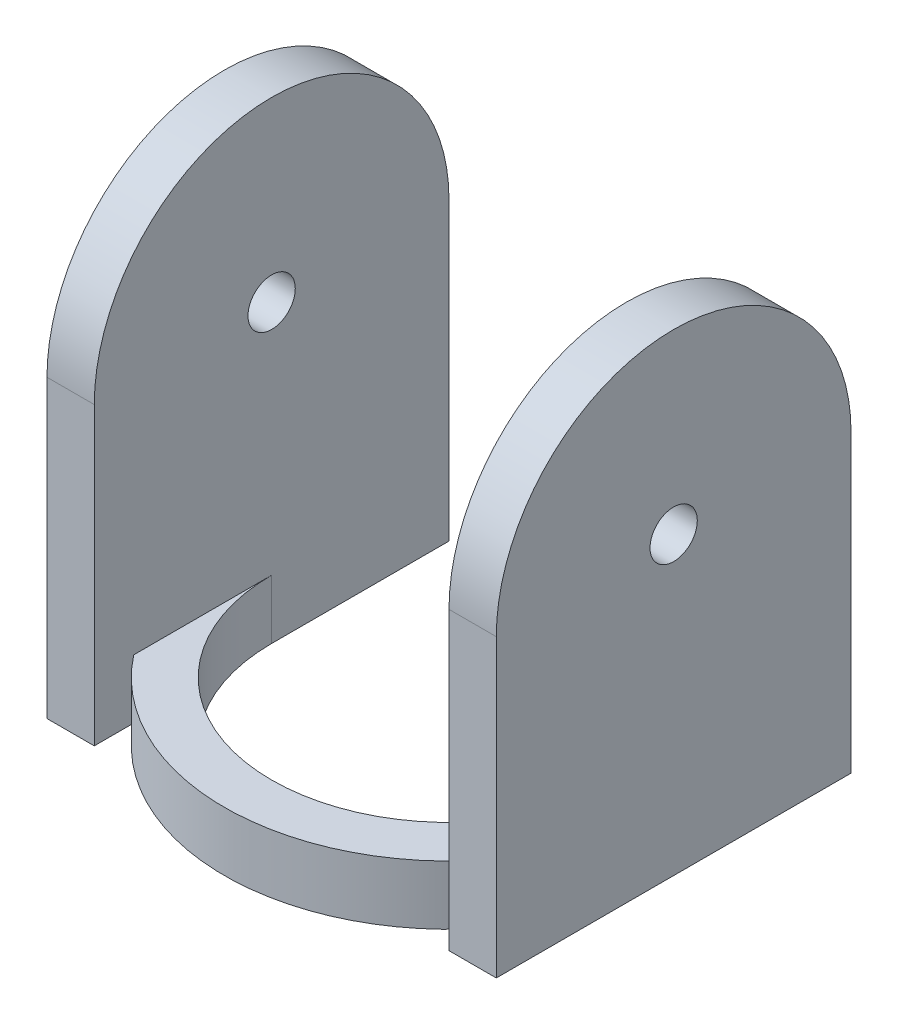
ISO-10303-21;
HEADER;
FILE_DESCRIPTION(('STEP AP214'),'2;1');
FILE_NAME('part.step','',(''),(''),'','','');
FILE_SCHEMA(('AUTOMOTIVE_DESIGN { 1 0 10303 214 1 1 1 1 }'));
ENDSEC;
DATA;
#1=APPLICATION_CONTEXT('core data for automotive mechanical design processes');
#2=APPLICATION_PROTOCOL_DEFINITION('international standard','automotive_design',2000,#1);
#3=PRODUCT_CONTEXT('',#1,'mechanical');
#4=PRODUCT('Part','Part','',(#3));
#5=PRODUCT_RELATED_PRODUCT_CATEGORY('part','',(#4));
#6=PRODUCT_DEFINITION_FORMATION('','',#4);
#7=PRODUCT_DEFINITION_CONTEXT('part definition',#1,'design');
#8=PRODUCT_DEFINITION('design','',#6,#7);
#9=PRODUCT_DEFINITION_SHAPE('','',#8);
#10=(LENGTH_UNIT() NAMED_UNIT(*) SI_UNIT(.MILLI.,.METRE.));
#11=(NAMED_UNIT(*) PLANE_ANGLE_UNIT() SI_UNIT($,.RADIAN.));
#12=(NAMED_UNIT(*) SI_UNIT($,.STERADIAN.) SOLID_ANGLE_UNIT());
#13=UNCERTAINTY_MEASURE_WITH_UNIT(LENGTH_MEASURE(1.E-05),#10,'distance_accuracy_value','');
#14=(GEOMETRIC_REPRESENTATION_CONTEXT(3) GLOBAL_UNCERTAINTY_ASSIGNED_CONTEXT((#13)) GLOBAL_UNIT_ASSIGNED_CONTEXT((#10,
#11,#12)) REPRESENTATION_CONTEXT('',''));
#15=CARTESIAN_POINT('',(0.,0.,0.));
#16=DIRECTION('',(0.,0.,1.));
#17=DIRECTION('',(1.,0.,0.));
#18=AXIS2_PLACEMENT_3D('',#15,#16,#17);
#19=CARTESIAN_POINT('',(-38.,80.,30.));
#20=DIRECTION('',(0.,0.,1.));
#21=DIRECTION('',(1.,0.,0.));
#22=AXIS2_PLACEMENT_3D('',#19,#20,#21);
#23=PLANE('',#22);
#24=DIRECTION('',(0.,-1.,0.));
#25=VECTOR('',#24,1.);
#26=CARTESIAN_POINT('',(-30.,80.,30.));
#27=LINE('',#26,#25);
#28=CARTESIAN_POINT('',(-30.,50.,30.));
#29=VERTEX_POINT('',#28);
#30=CARTESIAN_POINT('',(-30.,0.,30.));
#31=VERTEX_POINT('',#30);
#32=EDGE_CURVE('E174',#29,#31,#27,.T.);
#33=ORIENTED_EDGE('',*,*,#32,.F.);
#34=DIRECTION('',(1.,0.,0.));
#35=VECTOR('',#34,1.);
#36=CARTESIAN_POINT('',(-42.,50.,30.));
#37=LINE('',#36,#35);
#38=CARTESIAN_POINT('',(-38.,50.,30.));
#39=VERTEX_POINT('',#38);
#40=EDGE_CURVE('E246',#39,#29,#37,.T.);
#41=ORIENTED_EDGE('',*,*,#40,.F.);
#42=DIRECTION('',(0.,-1.,0.));
#43=VECTOR('',#42,1.);
#44=CARTESIAN_POINT('',(-38.,80.,30.));
#45=LINE('',#44,#43);
#46=CARTESIAN_POINT('',(-38.,0.,30.));
#47=VERTEX_POINT('',#46);
#48=EDGE_CURVE('E166',#39,#47,#45,.T.);
#49=ORIENTED_EDGE('',*,*,#48,.T.);
#50=DIRECTION('',(-1.,0.,0.));
#51=VECTOR('',#50,1.);
#52=CARTESIAN_POINT('',(-38.,0.,30.));
#53=LINE('',#52,#51);
#54=EDGE_CURVE('E140',#31,#47,#53,.T.);
#55=ORIENTED_EDGE('',*,*,#54,.F.);
#56=EDGE_LOOP('',(#33,#41,#49,#55));
#57=FACE_BOUND('',#56,.T.);
#58=ADVANCED_FACE('F38',(#57),#23,.T.);
#59=CARTESIAN_POINT('',(38.,80.,30.));
#60=DIRECTION('',(0.,0.,1.));
#61=DIRECTION('',(1.,0.,0.));
#62=AXIS2_PLACEMENT_3D('',#59,#60,#61);
#63=PLANE('',#62);
#64=DIRECTION('',(0.,-1.,0.));
#65=VECTOR('',#64,1.);
#66=CARTESIAN_POINT('',(38.,80.,30.));
#67=LINE('',#66,#65);
#68=CARTESIAN_POINT('',(38.,50.,30.));
#69=VERTEX_POINT('',#68);
#70=CARTESIAN_POINT('',(38.,0.,30.));
#71=VERTEX_POINT('',#70);
#72=EDGE_CURVE('E195',#69,#71,#67,.T.);
#73=ORIENTED_EDGE('',*,*,#72,.F.);
#74=CARTESIAN_POINT('',(30.,50.,30.));
#75=VERTEX_POINT('',#74);
#76=EDGE_CURVE('E252',#75,#69,#37,.T.);
#77=ORIENTED_EDGE('',*,*,#76,.F.);
#78=DIRECTION('',(0.,-1.,0.));
#79=VECTOR('',#78,1.);
#80=CARTESIAN_POINT('',(30.,80.,30.));
#81=LINE('',#80,#79);
#82=CARTESIAN_POINT('',(30.,0.,30.));
#83=VERTEX_POINT('',#82);
#84=EDGE_CURVE('E198',#75,#83,#81,.T.);
#85=ORIENTED_EDGE('',*,*,#84,.T.);
#86=DIRECTION('',(-1.,0.,0.));
#87=VECTOR('',#86,1.);
#88=CARTESIAN_POINT('',(38.,0.,30.));
#89=LINE('',#88,#87);
#90=EDGE_CURVE('E214',#71,#83,#89,.T.);
#91=ORIENTED_EDGE('',*,*,#90,.F.);
#92=EDGE_LOOP('',(#73,#77,#85,#91));
#93=FACE_BOUND('',#92,.T.);
#94=ADVANCED_FACE('F295',(#93),#63,.T.);
#95=CARTESIAN_POINT('',(0.,10.,0.));
#96=DIRECTION('',(0.,1.,0.));
#97=DIRECTION('',(0.,0.,1.));
#98=AXIS2_PLACEMENT_3D('',#95,#96,#97);
#99=PLANE('',#98);
#100=DIRECTION('',(0.,0.,1.));
#101=VECTOR('',#100,1.);
#102=CARTESIAN_POINT('',(30.,10.,0.));
#103=LINE('',#102,#101);
#104=CARTESIAN_POINT('',(30.,9.99999999999999,0.));
#105=VERTEX_POINT('',#104);
#106=CARTESIAN_POINT('',(30.,10.,23.3238075793812));
#107=VERTEX_POINT('',#106);
#108=EDGE_CURVE('E190',#105,#107,#103,.T.);
#109=ORIENTED_EDGE('',*,*,#108,.F.);
#110=CARTESIAN_POINT('',(0.,10.,0.));
#111=DIRECTION('',(0.,1.,0.));
#112=DIRECTION('',(0.,0.,1.));
#113=AXIS2_PLACEMENT_3D('',#110,#111,#112);
#114=CIRCLE('',#113,30.);
#115=CARTESIAN_POINT('',(-30.,10.,0.));
#116=VERTEX_POINT('',#115);
#117=EDGE_CURVE('E157',#116,#105,#114,.T.);
#118=ORIENTED_EDGE('',*,*,#117,.F.);
#119=DIRECTION('',(0.,0.,-1.));
#120=VECTOR('',#119,1.);
#121=CARTESIAN_POINT('',(-30.,10.,0.));
#122=LINE('',#121,#120);
#123=CARTESIAN_POINT('',(-30.,10.,23.3238075793812));
#124=VERTEX_POINT('',#123);
#125=EDGE_CURVE('E147',#124,#116,#122,.T.);
#126=ORIENTED_EDGE('',*,*,#125,.F.);
#127=CARTESIAN_POINT('',(0.,10.,0.));
#128=DIRECTION('',(0.,1.,0.));
#129=DIRECTION('',(0.,0.,1.));
#130=AXIS2_PLACEMENT_3D('',#127,#128,#129);
#131=CIRCLE('',#130,38.);
#132=EDGE_CURVE('E11',#124,#107,#131,.T.);
#133=ORIENTED_EDGE('',*,*,#132,.T.);
#134=EDGE_LOOP('',(#109,#118,#126,#133));
#135=FACE_BOUND('',#134,.T.);
#136=ADVANCED_FACE('F300',(#135),#99,.T.);
#137=CARTESIAN_POINT('',(0.,0.,0.));
#138=DIRECTION('',(0.,1.,0.));
#139=DIRECTION('',(0.,0.,1.));
#140=AXIS2_PLACEMENT_3D('',#137,#138,#139);
#141=PLANE('',#140);
#142=DIRECTION('',(0.,0.,1.));
#143=VECTOR('',#142,1.);
#144=CARTESIAN_POINT('',(-30.,0.,30.));
#145=LINE('',#144,#143);
#146=CARTESIAN_POINT('',(-30.,0.,-30.));
#147=VERTEX_POINT('',#146);
#148=CARTESIAN_POINT('',(-30.,0.,0.));
#149=VERTEX_POINT('',#148);
#150=EDGE_CURVE('E129',#147,#149,#145,.T.);
#151=ORIENTED_EDGE('',*,*,#150,.T.);
#152=CARTESIAN_POINT('',(0.,0.,0.));
#153=DIRECTION('',(0.,1.,0.));
#154=DIRECTION('',(0.,0.,1.));
#155=AXIS2_PLACEMENT_3D('',#152,#153,#154);
#156=CIRCLE('',#155,30.);
#157=CARTESIAN_POINT('',(30.,0.,0.));
#158=VERTEX_POINT('',#157);
#159=EDGE_CURVE('E133',#149,#158,#156,.T.);
#160=ORIENTED_EDGE('',*,*,#159,.T.);
#161=DIRECTION('',(0.,0.,-1.));
#162=VECTOR('',#161,1.);
#163=CARTESIAN_POINT('',(30.,0.,30.));
#164=LINE('',#163,#162);
#165=CARTESIAN_POINT('',(30.,0.,-30.));
#166=VERTEX_POINT('',#165);
#167=EDGE_CURVE('E54',#158,#166,#164,.T.);
#168=ORIENTED_EDGE('',*,*,#167,.T.);
#169=DIRECTION('',(1.,0.,0.));
#170=VECTOR('',#169,1.);
#171=CARTESIAN_POINT('',(38.,0.,-30.));
#172=LINE('',#171,#170);
#173=CARTESIAN_POINT('',(38.,0.,-30.));
#174=VERTEX_POINT('',#173);
#175=EDGE_CURVE('E199',#166,#174,#172,.T.);
#176=ORIENTED_EDGE('',*,*,#175,.T.);
#177=DIRECTION('',(0.,0.,1.));
#178=VECTOR('',#177,1.);
#179=CARTESIAN_POINT('',(38.,0.,30.));
#180=LINE('',#179,#178);
#181=EDGE_CURVE('E218',#174,#71,#180,.T.);
#182=ORIENTED_EDGE('',*,*,#181,.T.);
#183=ORIENTED_EDGE('',*,*,#90,.T.);
#184=CARTESIAN_POINT('',(30.,0.,23.3238075793812));
#185=VERTEX_POINT('',#184);
#186=EDGE_CURVE('E210',#83,#185,#164,.T.);
#187=ORIENTED_EDGE('',*,*,#186,.T.);
#188=CARTESIAN_POINT('',(0.,0.,0.));
#189=DIRECTION('',(0.,1.,0.));
#190=DIRECTION('',(0.,0.,1.));
#191=AXIS2_PLACEMENT_3D('',#188,#189,#190);
#192=CIRCLE('',#191,38.);
#193=CARTESIAN_POINT('',(-30.,0.,23.3238075793812));
#194=VERTEX_POINT('',#193);
#195=EDGE_CURVE('E42',#194,#185,#192,.T.);
#196=ORIENTED_EDGE('',*,*,#195,.F.);
#197=EDGE_CURVE('E141',#194,#31,#145,.T.);
#198=ORIENTED_EDGE('',*,*,#197,.T.);
#199=ORIENTED_EDGE('',*,*,#54,.T.);
#200=DIRECTION('',(0.,0.,-1.));
#201=VECTOR('',#200,1.);
#202=CARTESIAN_POINT('',(-38.,0.,30.));
#203=LINE('',#202,#201);
#204=CARTESIAN_POINT('',(-38.,0.,-30.));
#205=VERTEX_POINT('',#204);
#206=EDGE_CURVE('E184',#47,#205,#203,.T.);
#207=ORIENTED_EDGE('',*,*,#206,.T.);
#208=DIRECTION('',(1.,0.,0.));
#209=VECTOR('',#208,1.);
#210=CARTESIAN_POINT('',(-38.,0.,-30.));
#211=LINE('',#210,#209);
#212=EDGE_CURVE('E136',#205,#147,#211,.T.);
#213=ORIENTED_EDGE('',*,*,#212,.T.);
#214=EDGE_LOOP('',(#151,#160,#168,#176,#182,#183,#187,#196,#198,#199,#207,#213));
#215=FACE_BOUND('',#214,.T.);
#216=ADVANCED_FACE('F131',(#215),#141,.F.);
#217=CARTESIAN_POINT('',(0.,10.,0.));
#218=DIRECTION('',(0.,-1.,0.));
#219=DIRECTION('',(0.,0.,-1.));
#220=AXIS2_PLACEMENT_3D('',#217,#218,#219);
#221=CYLINDRICAL_SURFACE('',#220,38.);
#222=ORIENTED_EDGE('',*,*,#195,.T.);
#223=DIRECTION('',(0.,-1.,0.));
#224=VECTOR('',#223,1.);
#225=CARTESIAN_POINT('',(30.,10.,23.3238075793812));
#226=LINE('',#225,#224);
#227=EDGE_CURVE('E187',#185,#107,#226,.F.);
#228=ORIENTED_EDGE('',*,*,#227,.T.);
#229=ORIENTED_EDGE('',*,*,#132,.F.);
#230=DIRECTION('',(0.,-1.,0.));
#231=VECTOR('',#230,1.);
#232=CARTESIAN_POINT('',(-30.,10.,23.3238075793812));
#233=LINE('',#232,#231);
#234=EDGE_CURVE('E162',#124,#194,#233,.T.);
#235=ORIENTED_EDGE('',*,*,#234,.T.);
#236=EDGE_LOOP('',(#222,#228,#229,#235));
#237=FACE_BOUND('',#236,.T.);
#238=ADVANCED_FACE('F40',(#237),#221,.T.);
#239=CARTESIAN_POINT('',(0.,10.,0.));
#240=DIRECTION('',(0.,-1.,0.));
#241=DIRECTION('',(0.,0.,-1.));
#242=AXIS2_PLACEMENT_3D('',#239,#240,#241);
#243=CYLINDRICAL_SURFACE('',#242,30.);
#244=DIRECTION('',(0.,-1.,0.));
#245=VECTOR('',#244,1.);
#246=CARTESIAN_POINT('',(-30.,80.,0.));
#247=LINE('',#246,#245);
#248=EDGE_CURVE('E144',#116,#149,#247,.T.);
#249=ORIENTED_EDGE('',*,*,#248,.F.);
#250=ORIENTED_EDGE('',*,*,#117,.T.);
#251=DIRECTION('',(0.,-1.,0.));
#252=VECTOR('',#251,1.);
#253=CARTESIAN_POINT('',(30.,80.,0.));
#254=LINE('',#253,#252);
#255=EDGE_CURVE('E153',#105,#158,#254,.T.);
#256=ORIENTED_EDGE('',*,*,#255,.T.);
#257=ORIENTED_EDGE('',*,*,#159,.F.);
#258=EDGE_LOOP('',(#249,#250,#256,#257));
#259=FACE_BOUND('',#258,.T.);
#260=ADVANCED_FACE('F155',(#259),#243,.F.);
#261=CARTESIAN_POINT('',(-30.,80.,30.));
#262=DIRECTION('',(1.,0.,0.));
#263=DIRECTION('',(0.,0.,-1.));
#264=AXIS2_PLACEMENT_3D('',#261,#262,#263);
#265=PLANE('',#264);
#266=CARTESIAN_POINT('',(-30.,50.,0.));
#267=DIRECTION('',(1.,0.,0.));
#268=DIRECTION('',(0.,0.,-1.));
#269=AXIS2_PLACEMENT_3D('',#266,#267,#268);
#270=CIRCLE('',#269,4.);
#271=CARTESIAN_POINT('',(-30.,50.,-4.00000000000002));
#272=VERTEX_POINT('',#271);
#273=EDGE_CURVE('E222',#272,#272,#270,.T.);
#274=ORIENTED_EDGE('',*,*,#273,.F.);
#275=EDGE_LOOP('',(#274));
#276=FACE_BOUND('',#275,.T.);
#277=DIRECTION('',(0.,-1.,0.));
#278=VECTOR('',#277,1.);
#279=CARTESIAN_POINT('',(-30.,80.,-30.));
#280=LINE('',#279,#278);
#281=CARTESIAN_POINT('',(-30.,50.,-30.));
#282=VERTEX_POINT('',#281);
#283=EDGE_CURVE('E171',#282,#147,#280,.T.);
#284=ORIENTED_EDGE('',*,*,#283,.F.);
#285=CARTESIAN_POINT('',(-30.,50.,0.));
#286=DIRECTION('',(1.,0.,0.));
#287=DIRECTION('',(0.,0.,-1.));
#288=AXIS2_PLACEMENT_3D('',#285,#286,#287);
#289=CIRCLE('',#288,30.);
#290=EDGE_CURVE('E62',#29,#282,#289,.F.);
#291=ORIENTED_EDGE('',*,*,#290,.F.);
#292=ORIENTED_EDGE('',*,*,#32,.T.);
#293=ORIENTED_EDGE('',*,*,#197,.F.);
#294=ORIENTED_EDGE('',*,*,#234,.F.);
#295=ORIENTED_EDGE('',*,*,#125,.T.);
#296=ORIENTED_EDGE('',*,*,#248,.T.);
#297=ORIENTED_EDGE('',*,*,#150,.F.);
#298=EDGE_LOOP('',(#284,#291,#292,#293,#294,#295,#296,#297));
#299=FACE_BOUND('',#298,.T.);
#300=ADVANCED_FACE('F145',(#276,#299),#265,.T.);
#301=CARTESIAN_POINT('',(-38.,80.,30.));
#302=DIRECTION('',(-1.,0.,0.));
#303=DIRECTION('',(0.,0.,1.));
#304=AXIS2_PLACEMENT_3D('',#301,#302,#303);
#305=PLANE('',#304);
#306=CARTESIAN_POINT('',(-38.,50.,0.));
#307=DIRECTION('',(-1.,0.,0.));
#308=DIRECTION('',(0.,0.,1.));
#309=AXIS2_PLACEMENT_3D('',#306,#307,#308);
#310=CIRCLE('',#309,30.);
#311=CARTESIAN_POINT('',(-38.,50.,-30.));
#312=VERTEX_POINT('',#311);
#313=EDGE_CURVE('E236',#312,#39,#310,.F.);
#314=ORIENTED_EDGE('',*,*,#313,.F.);
#315=DIRECTION('',(0.,-1.,0.));
#316=VECTOR('',#315,1.);
#317=CARTESIAN_POINT('',(-38.,80.,-30.));
#318=LINE('',#317,#316);
#319=EDGE_CURVE('E168',#312,#205,#318,.T.);
#320=ORIENTED_EDGE('',*,*,#319,.T.);
#321=ORIENTED_EDGE('',*,*,#206,.F.);
#322=ORIENTED_EDGE('',*,*,#48,.F.);
#323=EDGE_LOOP('',(#314,#320,#321,#322));
#324=FACE_BOUND('',#323,.T.);
#325=CARTESIAN_POINT('',(-38.,50.,0.));
#326=DIRECTION('',(-1.,0.,0.));
#327=DIRECTION('',(0.,0.,1.));
#328=AXIS2_PLACEMENT_3D('',#325,#326,#327);
#329=CIRCLE('',#328,4.);
#330=CARTESIAN_POINT('',(-38.,50.,3.99999999999998));
#331=VERTEX_POINT('',#330);
#332=EDGE_CURVE('E226',#331,#331,#329,.T.);
#333=ORIENTED_EDGE('',*,*,#332,.F.);
#334=EDGE_LOOP('',(#333));
#335=FACE_BOUND('',#334,.T.);
#336=ADVANCED_FACE('F273',(#324,#335),#305,.T.);
#337=CARTESIAN_POINT('',(-38.,80.,-30.));
#338=DIRECTION('',(0.,0.,-1.));
#339=DIRECTION('',(-1.,0.,0.));
#340=AXIS2_PLACEMENT_3D('',#337,#338,#339);
#341=PLANE('',#340);
#342=DIRECTION('',(1.,0.,0.));
#343=VECTOR('',#342,1.);
#344=CARTESIAN_POINT('',(-42.,50.,-30.));
#345=LINE('',#344,#343);
#346=EDGE_CURVE('E251',#312,#282,#345,.T.);
#347=ORIENTED_EDGE('',*,*,#346,.T.);
#348=ORIENTED_EDGE('',*,*,#283,.T.);
#349=ORIENTED_EDGE('',*,*,#212,.F.);
#350=ORIENTED_EDGE('',*,*,#319,.F.);
#351=EDGE_LOOP('',(#347,#348,#349,#350));
#352=FACE_BOUND('',#351,.T.);
#353=ADVANCED_FACE('F277',(#352),#341,.T.);
#354=CARTESIAN_POINT('',(30.,80.,30.));
#355=DIRECTION('',(-1.,0.,0.));
#356=DIRECTION('',(0.,0.,1.));
#357=AXIS2_PLACEMENT_3D('',#354,#355,#356);
#358=PLANE('',#357);
#359=ORIENTED_EDGE('',*,*,#255,.F.);
#360=ORIENTED_EDGE('',*,*,#108,.T.);
#361=ORIENTED_EDGE('',*,*,#227,.F.);
#362=ORIENTED_EDGE('',*,*,#186,.F.);
#363=ORIENTED_EDGE('',*,*,#84,.F.);
#364=CARTESIAN_POINT('',(30.,50.,0.));
#365=DIRECTION('',(-1.,0.,0.));
#366=DIRECTION('',(0.,0.,1.));
#367=AXIS2_PLACEMENT_3D('',#364,#365,#366);
#368=CIRCLE('',#367,30.);
#369=CARTESIAN_POINT('',(30.,50.,-30.));
#370=VERTEX_POINT('',#369);
#371=EDGE_CURVE('E239',#370,#75,#368,.F.);
#372=ORIENTED_EDGE('',*,*,#371,.F.);
#373=DIRECTION('',(0.,-1.,0.));
#374=VECTOR('',#373,1.);
#375=CARTESIAN_POINT('',(30.,80.,-30.));
#376=LINE('',#375,#374);
#377=EDGE_CURVE('E202',#370,#166,#376,.T.);
#378=ORIENTED_EDGE('',*,*,#377,.T.);
#379=ORIENTED_EDGE('',*,*,#167,.F.);
#380=EDGE_LOOP('',(#359,#360,#361,#362,#363,#372,#378,#379));
#381=FACE_BOUND('',#380,.T.);
#382=CARTESIAN_POINT('',(30.,50.,0.));
#383=DIRECTION('',(-1.,0.,0.));
#384=DIRECTION('',(0.,0.,1.));
#385=AXIS2_PLACEMENT_3D('',#382,#383,#384);
#386=CIRCLE('',#385,4.);
#387=CARTESIAN_POINT('',(30.,50.,4.));
#388=VERTEX_POINT('',#387);
#389=EDGE_CURVE('E230',#388,#388,#386,.T.);
#390=ORIENTED_EDGE('',*,*,#389,.F.);
#391=EDGE_LOOP('',(#390));
#392=FACE_BOUND('',#391,.T.);
#393=ADVANCED_FACE('F311',(#381,#392),#358,.T.);
#394=CARTESIAN_POINT('',(38.,80.,30.));
#395=DIRECTION('',(1.,0.,0.));
#396=DIRECTION('',(0.,0.,-1.));
#397=AXIS2_PLACEMENT_3D('',#394,#395,#396);
#398=PLANE('',#397);
#399=CARTESIAN_POINT('',(38.,50.,0.));
#400=DIRECTION('',(-1.,0.,0.));
#401=DIRECTION('',(0.,0.,-1.));
#402=AXIS2_PLACEMENT_3D('',#399,#400,#401);
#403=CIRCLE('',#402,30.);
#404=CARTESIAN_POINT('',(38.,50.,-30.));
#405=VERTEX_POINT('',#404);
#406=EDGE_CURVE('E152',#69,#405,#403,.T.);
#407=ORIENTED_EDGE('',*,*,#406,.F.);
#408=ORIENTED_EDGE('',*,*,#72,.T.);
#409=ORIENTED_EDGE('',*,*,#181,.F.);
#410=DIRECTION('',(0.,-1.,0.));
#411=VECTOR('',#410,1.);
#412=CARTESIAN_POINT('',(38.,80.,-30.));
#413=LINE('',#412,#411);
#414=EDGE_CURVE('E194',#405,#174,#413,.T.);
#415=ORIENTED_EDGE('',*,*,#414,.F.);
#416=EDGE_LOOP('',(#407,#408,#409,#415));
#417=FACE_BOUND('',#416,.T.);
#418=CARTESIAN_POINT('',(38.,50.,0.));
#419=DIRECTION('',(1.,0.,0.));
#420=DIRECTION('',(0.,0.,-1.));
#421=AXIS2_PLACEMENT_3D('',#418,#419,#420);
#422=CIRCLE('',#421,4.);
#423=CARTESIAN_POINT('',(38.,50.,-4.));
#424=VERTEX_POINT('',#423);
#425=EDGE_CURVE('E242',#424,#424,#422,.T.);
#426=ORIENTED_EDGE('',*,*,#425,.F.);
#427=EDGE_LOOP('',(#426));
#428=FACE_BOUND('',#427,.T.);
#429=ADVANCED_FACE('F305',(#417,#428),#398,.T.);
#430=CARTESIAN_POINT('',(38.,80.,-30.));
#431=DIRECTION('',(0.,0.,-1.));
#432=DIRECTION('',(-1.,0.,0.));
#433=AXIS2_PLACEMENT_3D('',#430,#431,#432);
#434=PLANE('',#433);
#435=EDGE_CURVE('E247',#370,#405,#345,.T.);
#436=ORIENTED_EDGE('',*,*,#435,.T.);
#437=ORIENTED_EDGE('',*,*,#414,.T.);
#438=ORIENTED_EDGE('',*,*,#175,.F.);
#439=ORIENTED_EDGE('',*,*,#377,.F.);
#440=EDGE_LOOP('',(#436,#437,#438,#439));
#441=FACE_BOUND('',#440,.T.);
#442=ADVANCED_FACE('F292',(#441),#434,.T.);
#443=CARTESIAN_POINT('',(-42.,50.,0.));
#444=DIRECTION('',(1.,0.,0.));
#445=DIRECTION('',(0.,0.,-1.));
#446=AXIS2_PLACEMENT_3D('',#443,#444,#445);
#447=CYLINDRICAL_SURFACE('',#446,30.);
#448=ORIENTED_EDGE('',*,*,#371,.T.);
#449=ORIENTED_EDGE('',*,*,#76,.T.);
#450=ORIENTED_EDGE('',*,*,#406,.T.);
#451=ORIENTED_EDGE('',*,*,#435,.F.);
#452=EDGE_LOOP('',(#448,#449,#450,#451));
#453=FACE_BOUND('',#452,.T.);
#454=ADVANCED_FACE('F283',(#453),#447,.T.);
#455=CARTESIAN_POINT('',(-42.,50.,0.));
#456=DIRECTION('',(1.,0.,0.));
#457=DIRECTION('',(0.,0.,-1.));
#458=AXIS2_PLACEMENT_3D('',#455,#456,#457);
#459=CYLINDRICAL_SURFACE('',#458,4.);
#460=ORIENTED_EDGE('',*,*,#389,.T.);
#461=EDGE_LOOP('',(#460));
#462=FACE_BOUND('',#461,.T.);
#463=ORIENTED_EDGE('',*,*,#425,.T.);
#464=EDGE_LOOP('',(#463));
#465=FACE_BOUND('',#464,.T.);
#466=ADVANCED_FACE('F281',(#462,#465),#459,.F.);
#467=ORIENTED_EDGE('',*,*,#290,.T.);
#468=ORIENTED_EDGE('',*,*,#346,.F.);
#469=ORIENTED_EDGE('',*,*,#313,.T.);
#470=ORIENTED_EDGE('',*,*,#40,.T.);
#471=EDGE_LOOP('',(#467,#468,#469,#470));
#472=FACE_BOUND('',#471,.T.);
#473=ADVANCED_FACE('F278',(#472),#447,.T.);
#474=ORIENTED_EDGE('',*,*,#273,.T.);
#475=EDGE_LOOP('',(#474));
#476=FACE_BOUND('',#475,.T.);
#477=ORIENTED_EDGE('',*,*,#332,.T.);
#478=EDGE_LOOP('',(#477));
#479=FACE_BOUND('',#478,.T.);
#480=ADVANCED_FACE('F280',(#476,#479),#459,.F.);
#481=CLOSED_SHELL('',(#58,#94,#136,#216,#238,#260,#300,#336,#353,#393,#429,#442,#454,#466,#473,#480));
#482=MANIFOLD_SOLID_BREP('B2',#481);
#483=ADVANCED_BREP_SHAPE_REPRESENTATION('',(#18,#482),#14);
#484=SHAPE_DEFINITION_REPRESENTATION(#9,#483);
ENDSEC;
END-ISO-10303-21;
